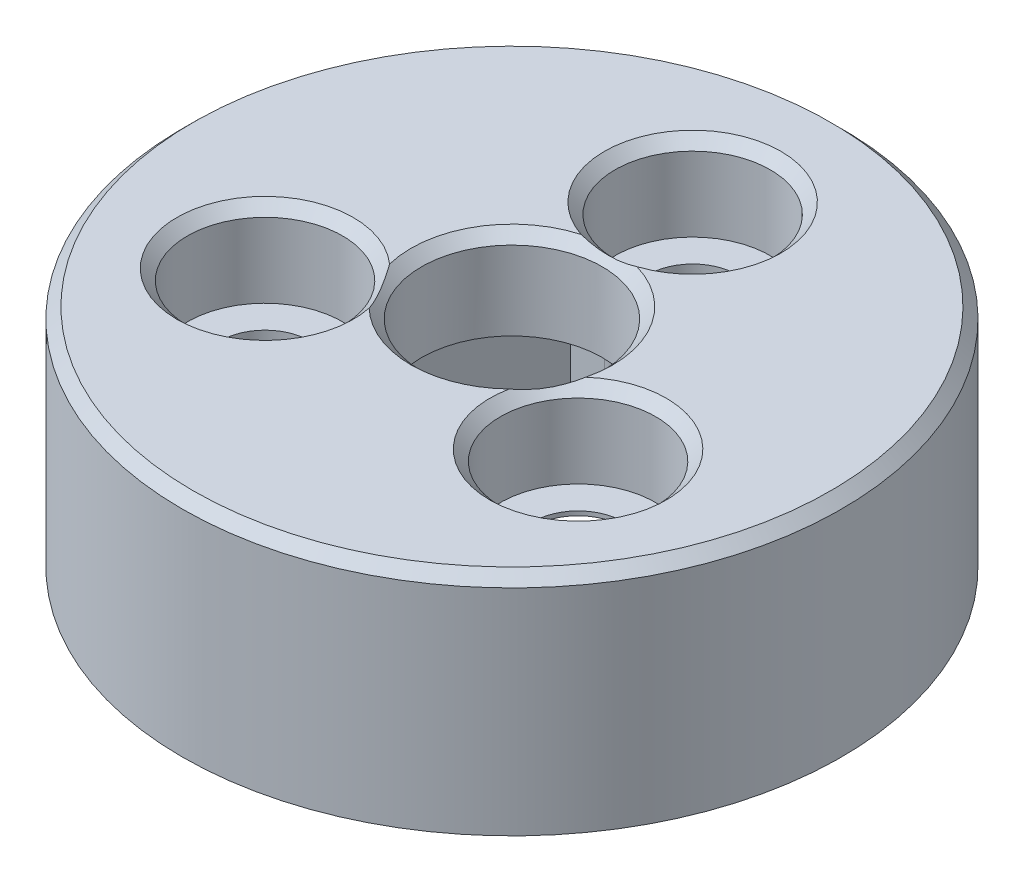
ISO-10303-21;
HEADER;
FILE_DESCRIPTION(('STEP AP214'),'2;1');
FILE_NAME('part.step','',(''),(''),'','','');
FILE_SCHEMA(('AUTOMOTIVE_DESIGN { 1 0 10303 214 1 1 1 1 }'));
ENDSEC;
DATA;
#1=APPLICATION_CONTEXT('core data for automotive mechanical design processes');
#2=APPLICATION_PROTOCOL_DEFINITION('international standard','automotive_design',2000,#1);
#3=PRODUCT_CONTEXT('',#1,'mechanical');
#4=PRODUCT('Part','Part','',(#3));
#5=PRODUCT_RELATED_PRODUCT_CATEGORY('part','',(#4));
#6=PRODUCT_DEFINITION_FORMATION('','',#4);
#7=PRODUCT_DEFINITION_CONTEXT('part definition',#1,'design');
#8=PRODUCT_DEFINITION('design','',#6,#7);
#9=PRODUCT_DEFINITION_SHAPE('','',#8);
#10=(LENGTH_UNIT() NAMED_UNIT(*) SI_UNIT(.MILLI.,.METRE.));
#11=(NAMED_UNIT(*) PLANE_ANGLE_UNIT() SI_UNIT($,.RADIAN.));
#12=(NAMED_UNIT(*) SI_UNIT($,.STERADIAN.) SOLID_ANGLE_UNIT());
#13=UNCERTAINTY_MEASURE_WITH_UNIT(LENGTH_MEASURE(1.E-05),#10,'distance_accuracy_value','');
#14=(GEOMETRIC_REPRESENTATION_CONTEXT(3) GLOBAL_UNCERTAINTY_ASSIGNED_CONTEXT((#13)) GLOBAL_UNIT_ASSIGNED_CONTEXT((#10,
#11,#12)) REPRESENTATION_CONTEXT('',''));
#15=CARTESIAN_POINT('',(0.,0.,0.));
#16=DIRECTION('',(0.,0.,1.));
#17=DIRECTION('',(1.,0.,0.));
#18=AXIS2_PLACEMENT_3D('',#15,#16,#17);
#19=CARTESIAN_POINT('',(-7.36121593216715,0.,4.25000000000033));
#20=DIRECTION('',(0.,1.,0.));
#21=DIRECTION('',(0.,0.,1.));
#22=AXIS2_PLACEMENT_3D('',#19,#20,#21);
#23=CYLINDRICAL_SURFACE('',#22,2.1);
#24=CARTESIAN_POINT('',(-7.36121593216715,6.4,4.25000000000033));
#25=DIRECTION('',(0.,-1.,0.));
#26=DIRECTION('',(0.,0.,-1.));
#27=AXIS2_PLACEMENT_3D('',#24,#25,#26);
#28=CIRCLE('',#27,2.1);
#29=CARTESIAN_POINT('',(-5.43622822501933,6.4,5.08929871162199));
#30=VERTEX_POINT('',#29);
#31=CARTESIAN_POINT('',(-7.11454987921227,6.4,2.16453701583599));
#32=VERTEX_POINT('',#31);
#33=EDGE_CURVE('E257',#30,#32,#28,.F.);
#34=ORIENTED_EDGE('',*,*,#33,.F.);
#35=DIRECTION('',(0.,1.,0.));
#36=VECTOR('',#35,1.);
#37=CARTESIAN_POINT('',(-5.43622822501933,0.,5.08929871162199));
#38=LINE('',#37,#36);
#39=CARTESIAN_POINT('',(-5.43622822501933,0.,5.08929871162199));
#40=VERTEX_POINT('',#39);
#41=EDGE_CURVE('E395',#30,#40,#38,.F.);
#42=ORIENTED_EDGE('',*,*,#41,.T.);
#43=CARTESIAN_POINT('',(-7.36121593216715,0.,4.25000000000033));
#44=DIRECTION('',(0.,1.,0.));
#45=DIRECTION('',(0.,0.,1.));
#46=AXIS2_PLACEMENT_3D('',#43,#44,#45);
#47=CIRCLE('',#46,2.1);
#48=CARTESIAN_POINT('',(-7.11454987921227,0.,2.16453701583599));
#49=VERTEX_POINT('',#48);
#50=EDGE_CURVE('E261',#49,#40,#47,.T.);
#51=ORIENTED_EDGE('',*,*,#50,.F.);
#52=DIRECTION('',(0.,1.,0.));
#53=VECTOR('',#52,1.);
#54=CARTESIAN_POINT('',(-7.11454987921227,0.,2.16453701583599));
#55=LINE('',#54,#53);
#56=EDGE_CURVE('E392',#49,#32,#55,.T.);
#57=ORIENTED_EDGE('',*,*,#56,.T.);
#58=EDGE_LOOP('',(#34,#42,#51,#57));
#59=FACE_BOUND('',#58,.T.);
#60=CARTESIAN_POINT('',(-7.36121593216715,6.6,4.25000000000033));
#61=DIRECTION('',(0.,1.,0.));
#62=DIRECTION('',(0.,0.,1.));
#63=AXIS2_PLACEMENT_3D('',#60,#61,#62);
#64=CIRCLE('',#63,2.1);
#65=CARTESIAN_POINT('',(-7.36121593216715,6.6,6.35000000000033));
#66=VERTEX_POINT('',#65);
#67=EDGE_CURVE('E283',#66,#66,#64,.F.);
#68=ORIENTED_EDGE('',*,*,#67,.F.);
#69=EDGE_LOOP('',(#68));
#70=FACE_BOUND('',#69,.T.);
#71=ADVANCED_FACE('F36',(#59,#70),#23,.F.);
#72=CARTESIAN_POINT('',(7.3612159321683,0.,4.24999999999967));
#73=DIRECTION('',(0.,1.,0.));
#74=DIRECTION('',(0.,0.,1.));
#75=AXIS2_PLACEMENT_3D('',#72,#73,#74);
#76=CYLINDRICAL_SURFACE('',#75,2.1);
#77=CARTESIAN_POINT('',(7.3612159321683,6.4,4.24999999999967));
#78=DIRECTION('',(0.,-1.,0.));
#79=DIRECTION('',(0.,0.,-1.));
#80=AXIS2_PLACEMENT_3D('',#77,#78,#79);
#81=CIRCLE('',#80,2.1);
#82=CARTESIAN_POINT('',(7.12557608422164,6.4,2.16326238782614));
#83=VERTEX_POINT('',#82);
#84=CARTESIAN_POINT('',(5.43181898275217,6.4,5.07911242397106));
#85=VERTEX_POINT('',#84);
#86=EDGE_CURVE('E255',#83,#85,#81,.F.);
#87=ORIENTED_EDGE('',*,*,#86,.F.);
#88=DIRECTION('',(0.,1.,0.));
#89=VECTOR('',#88,1.);
#90=CARTESIAN_POINT('',(7.12557608422164,0.,2.16326238782614));
#91=LINE('',#90,#89);
#92=CARTESIAN_POINT('',(7.12557608422164,0.,2.16326238782614));
#93=VERTEX_POINT('',#92);
#94=EDGE_CURVE('E373',#83,#93,#91,.F.);
#95=ORIENTED_EDGE('',*,*,#94,.T.);
#96=CARTESIAN_POINT('',(7.3612159321683,0.,4.24999999999967));
#97=DIRECTION('',(0.,1.,0.));
#98=DIRECTION('',(0.,0.,1.));
#99=AXIS2_PLACEMENT_3D('',#96,#97,#98);
#100=CIRCLE('',#99,2.1);
#101=CARTESIAN_POINT('',(5.43181898275217,0.,5.07911242397106));
#102=VERTEX_POINT('',#101);
#103=EDGE_CURVE('E262',#102,#93,#100,.T.);
#104=ORIENTED_EDGE('',*,*,#103,.F.);
#105=DIRECTION('',(0.,1.,0.));
#106=VECTOR('',#105,1.);
#107=CARTESIAN_POINT('',(5.43181898275217,0.,5.07911242397106));
#108=LINE('',#107,#106);
#109=EDGE_CURVE('E323',#102,#85,#108,.T.);
#110=ORIENTED_EDGE('',*,*,#109,.T.);
#111=EDGE_LOOP('',(#87,#95,#104,#110));
#112=FACE_BOUND('',#111,.T.);
#113=CARTESIAN_POINT('',(7.3612159321683,6.6,4.24999999999967));
#114=DIRECTION('',(0.,1.,0.));
#115=DIRECTION('',(0.,0.,1.));
#116=AXIS2_PLACEMENT_3D('',#113,#114,#115);
#117=CIRCLE('',#116,2.1);
#118=CARTESIAN_POINT('',(7.3612159321683,6.6,6.34999999999967));
#119=VERTEX_POINT('',#118);
#120=EDGE_CURVE('E280',#119,#119,#117,.F.);
#121=ORIENTED_EDGE('',*,*,#120,.F.);
#122=EDGE_LOOP('',(#121));
#123=FACE_BOUND('',#122,.T.);
#124=ADVANCED_FACE('F463',(#112,#123),#76,.F.);
#125=CARTESIAN_POINT('',(0.,0.,-8.5));
#126=DIRECTION('',(0.,1.,0.));
#127=DIRECTION('',(0.,0.,1.));
#128=AXIS2_PLACEMENT_3D('',#125,#126,#127);
#129=CYLINDRICAL_SURFACE('',#128,2.1);
#130=CARTESIAN_POINT('',(0.,0.,-8.5));
#131=DIRECTION('',(0.,1.,0.));
#132=DIRECTION('',(0.,0.,1.));
#133=AXIS2_PLACEMENT_3D('',#130,#131,#132);
#134=CIRCLE('',#133,2.1);
#135=CARTESIAN_POINT('',(1.68273089646079,0.,-7.24364943980739));
#136=VERTEX_POINT('',#135);
#137=CARTESIAN_POINT('',(-1.68934785920162,0.,-7.25256109944779));
#138=VERTEX_POINT('',#137);
#139=EDGE_CURVE('E265',#136,#138,#134,.T.);
#140=ORIENTED_EDGE('',*,*,#139,.F.);
#141=DIRECTION('',(0.,1.,0.));
#142=VECTOR('',#141,1.);
#143=CARTESIAN_POINT('',(1.68273089646079,0.,-7.24364943980739));
#144=LINE('',#143,#142);
#145=CARTESIAN_POINT('',(1.68273089646079,6.4,-7.24364943980739));
#146=VERTEX_POINT('',#145);
#147=EDGE_CURVE('E405',#136,#146,#144,.T.);
#148=ORIENTED_EDGE('',*,*,#147,.T.);
#149=CARTESIAN_POINT('',(0.,6.4,-8.5));
#150=DIRECTION('',(0.,-1.,0.));
#151=DIRECTION('',(0.,0.,-1.));
#152=AXIS2_PLACEMENT_3D('',#149,#150,#151);
#153=CIRCLE('',#152,2.1);
#154=CARTESIAN_POINT('',(-1.68934785920162,6.4,-7.25256109944779));
#155=VERTEX_POINT('',#154);
#156=EDGE_CURVE('E259',#155,#146,#153,.F.);
#157=ORIENTED_EDGE('',*,*,#156,.F.);
#158=DIRECTION('',(0.,1.,0.));
#159=VECTOR('',#158,1.);
#160=CARTESIAN_POINT('',(-1.68934785920162,0.,-7.25256109944779));
#161=LINE('',#160,#159);
#162=EDGE_CURVE('E402',#155,#138,#161,.F.);
#163=ORIENTED_EDGE('',*,*,#162,.T.);
#164=EDGE_LOOP('',(#140,#148,#157,#163));
#165=FACE_BOUND('',#164,.T.);
#166=CARTESIAN_POINT('',(0.,6.6,-8.5));
#167=DIRECTION('',(0.,1.,0.));
#168=DIRECTION('',(0.,0.,1.));
#169=AXIS2_PLACEMENT_3D('',#166,#167,#168);
#170=CIRCLE('',#169,2.1);
#171=CARTESIAN_POINT('',(0.,6.6,-6.4));
#172=VERTEX_POINT('',#171);
#173=EDGE_CURVE('E276',#172,#172,#170,.F.);
#174=ORIENTED_EDGE('',*,*,#173,.F.);
#175=EDGE_LOOP('',(#174));
#176=FACE_BOUND('',#175,.T.);
#177=ADVANCED_FACE('F491',(#165,#176),#129,.F.);
#178=CARTESIAN_POINT('',(0.,0.,0.));
#179=DIRECTION('',(0.,1.,0.));
#180=DIRECTION('',(0.,0.,1.));
#181=AXIS2_PLACEMENT_3D('',#178,#179,#180);
#182=CYLINDRICAL_SURFACE('',#181,4.25);
#183=CARTESIAN_POINT('',(0.,10.1,0.));
#184=DIRECTION('',(0.,1.,0.));
#185=DIRECTION('',(0.,0.,1.));
#186=AXIS2_PLACEMENT_3D('',#183,#184,#185);
#187=CIRCLE('',#186,4.25);
#188=CARTESIAN_POINT('',(0.,10.1,4.25));
#189=VERTEX_POINT('',#188);
#190=EDGE_CURVE('E314',#189,#189,#187,.T.);
#191=ORIENTED_EDGE('',*,*,#190,.T.);
#192=EDGE_LOOP('',(#191));
#193=FACE_BOUND('',#192,.T.);
#194=CARTESIAN_POINT('',(0.,6.4,0.));
#195=DIRECTION('',(0.,-1.,0.));
#196=DIRECTION('',(0.,0.,-1.));
#197=AXIS2_PLACEMENT_3D('',#194,#195,#196);
#198=CIRCLE('',#197,4.25);
#199=CARTESIAN_POINT('',(0.,6.4,-4.25));
#200=VERTEX_POINT('',#199);
#201=EDGE_CURVE('E245',#200,#200,#198,.F.);
#202=ORIENTED_EDGE('',*,*,#201,.F.);
#203=EDGE_LOOP('',(#202));
#204=FACE_BOUND('',#203,.T.);
#205=ADVANCED_FACE('F497',(#193,#204),#182,.F.);
#206=CARTESIAN_POINT('',(0.,10.6,0.));
#207=DIRECTION('',(0.,-1.,0.));
#208=DIRECTION('',(0.,0.,-1.));
#209=AXIS2_PLACEMENT_3D('',#206,#207,#208);
#210=CYLINDRICAL_SURFACE('',#209,15.5);
#211=CARTESIAN_POINT('',(0.,10.1,0.));
#212=DIRECTION('',(0.,1.,0.));
#213=DIRECTION('',(0.,0.,1.));
#214=AXIS2_PLACEMENT_3D('',#211,#212,#213);
#215=CIRCLE('',#214,15.5);
#216=CARTESIAN_POINT('',(0.,10.1,15.5));
#217=VERTEX_POINT('',#216);
#218=EDGE_CURVE('E320',#217,#217,#215,.F.);
#219=ORIENTED_EDGE('',*,*,#218,.T.);
#220=EDGE_LOOP('',(#219));
#221=FACE_BOUND('',#220,.T.);
#222=CARTESIAN_POINT('',(0.,0.,0.));
#223=DIRECTION('',(0.,1.,0.));
#224=DIRECTION('',(0.,0.,1.));
#225=AXIS2_PLACEMENT_3D('',#222,#223,#224);
#226=CIRCLE('',#225,15.5);
#227=CARTESIAN_POINT('',(0.,0.,15.5));
#228=VERTEX_POINT('',#227);
#229=EDGE_CURVE('E270',#228,#228,#226,.T.);
#230=ORIENTED_EDGE('',*,*,#229,.T.);
#231=EDGE_LOOP('',(#230));
#232=FACE_BOUND('',#231,.T.);
#233=ADVANCED_FACE('F502',(#221,#232),#210,.T.);
#234=CARTESIAN_POINT('',(0.,10.6,0.));
#235=DIRECTION('',(0.,1.,0.));
#236=DIRECTION('',(0.,0.,1.));
#237=AXIS2_PLACEMENT_3D('',#234,#235,#236);
#238=PLANE('',#237);
#239=CARTESIAN_POINT('',(7.3612159321683,10.6,4.24999999999967));
#240=DIRECTION('',(0.,1.,0.));
#241=DIRECTION('',(0.,0.,1.));
#242=AXIS2_PLACEMENT_3D('',#239,#240,#241);
#243=CIRCLE('',#242,4.15);
#244=CARTESIAN_POINT('',(4.61054191633621,10.6,1.14254244459748));
#245=VERTEX_POINT('',#244);
#246=CARTESIAN_POINT('',(7.3612159321683,10.6,8.39999999999967));
#247=VERTEX_POINT('',#246);
#248=EDGE_CURVE('E298',#245,#247,#243,.F.);
#249=ORIENTED_EDGE('',*,*,#248,.T.);
#250=CARTESIAN_POINT('',(7.3612159321683,10.6,4.24999999999967));
#251=DIRECTION('',(0.,1.,0.));
#252=DIRECTION('',(0.,0.,1.));
#253=AXIS2_PLACEMENT_3D('',#250,#251,#252);
#254=CIRCLE('',#253,4.15);
#255=CARTESIAN_POINT('',(3.29474174009196,10.6,3.42157520246096));
#256=VERTEX_POINT('',#255);
#257=EDGE_CURVE('E309',#247,#256,#254,.F.);
#258=ORIENTED_EDGE('',*,*,#257,.T.);
#259=CARTESIAN_POINT('',(0.,10.6,0.));
#260=DIRECTION('',(0.,1.,0.));
#261=DIRECTION('',(0.,0.,1.));
#262=AXIS2_PLACEMENT_3D('',#259,#260,#261);
#263=CIRCLE('',#262,4.75);
#264=CARTESIAN_POINT('',(0.,10.6,4.75));
#265=VERTEX_POINT('',#264);
#266=EDGE_CURVE('E307',#256,#265,#263,.F.);
#267=ORIENTED_EDGE('',*,*,#266,.T.);
#268=CARTESIAN_POINT('',(0.,10.6,0.));
#269=DIRECTION('',(0.,1.,0.));
#270=DIRECTION('',(0.,0.,1.));
#271=AXIS2_PLACEMENT_3D('',#268,#269,#270);
#272=CIRCLE('',#271,4.75);
#273=CARTESIAN_POINT('',(-3.2947417400907,10.6,3.42157520246218));
#274=VERTEX_POINT('',#273);
#275=EDGE_CURVE('E305',#265,#274,#272,.F.);
#276=ORIENTED_EDGE('',*,*,#275,.T.);
#277=CARTESIAN_POINT('',(-7.36121593216715,10.6,4.25000000000033));
#278=DIRECTION('',(0.,1.,0.));
#279=DIRECTION('',(0.,0.,1.));
#280=AXIS2_PLACEMENT_3D('',#277,#278,#279);
#281=CIRCLE('',#280,4.15);
#282=CARTESIAN_POINT('',(-7.36121593216715,10.6,8.40000000000034));
#283=VERTEX_POINT('',#282);
#284=EDGE_CURVE('E302',#274,#283,#281,.F.);
#285=ORIENTED_EDGE('',*,*,#284,.T.);
#286=CARTESIAN_POINT('',(-7.36121593216715,10.6,4.25000000000033));
#287=DIRECTION('',(0.,1.,0.));
#288=DIRECTION('',(0.,0.,1.));
#289=AXIS2_PLACEMENT_3D('',#286,#287,#288);
#290=CIRCLE('',#289,4.15);
#291=CARTESIAN_POINT('',(-4.61054191633632,10.6,1.14254244459703));
#292=VERTEX_POINT('',#291);
#293=EDGE_CURVE('E300',#283,#292,#290,.F.);
#294=ORIENTED_EDGE('',*,*,#293,.T.);
#295=CARTESIAN_POINT('',(0.,10.6,0.));
#296=DIRECTION('',(0.,1.,0.));
#297=DIRECTION('',(0.,0.,1.));
#298=AXIS2_PLACEMENT_3D('',#295,#296,#297);
#299=CIRCLE('',#298,4.75);
#300=CARTESIAN_POINT('',(-1.31580017624494,10.6,-4.56411764705882));
#301=VERTEX_POINT('',#300);
#302=EDGE_CURVE('E294',#292,#301,#299,.F.);
#303=ORIENTED_EDGE('',*,*,#302,.T.);
#304=CARTESIAN_POINT('',(0.,10.6,-8.5));
#305=DIRECTION('',(0.,1.,0.));
#306=DIRECTION('',(0.,0.,1.));
#307=AXIS2_PLACEMENT_3D('',#304,#305,#306);
#308=CIRCLE('',#307,4.15);
#309=CARTESIAN_POINT('',(1.31580017624494,10.6,-4.56411764705882));
#310=VERTEX_POINT('',#309);
#311=EDGE_CURVE('E292',#301,#310,#308,.F.);
#312=ORIENTED_EDGE('',*,*,#311,.T.);
#313=CARTESIAN_POINT('',(0.,10.6,0.));
#314=DIRECTION('',(0.,1.,0.));
#315=DIRECTION('',(0.,0.,1.));
#316=AXIS2_PLACEMENT_3D('',#313,#314,#315);
#317=CIRCLE('',#316,4.75);
#318=EDGE_CURVE('E296',#310,#245,#317,.F.);
#319=ORIENTED_EDGE('',*,*,#318,.T.);
#320=EDGE_LOOP('',(#249,#258,#267,#276,#285,#294,#303,#312,#319));
#321=FACE_BOUND('',#320,.T.);
#322=CARTESIAN_POINT('',(0.,10.6,0.));
#323=DIRECTION('',(0.,1.,0.));
#324=DIRECTION('',(0.,0.,1.));
#325=AXIS2_PLACEMENT_3D('',#322,#323,#324);
#326=CIRCLE('',#325,15.);
#327=CARTESIAN_POINT('',(0.,10.6,15.));
#328=VERTEX_POINT('',#327);
#329=EDGE_CURVE('E289',#328,#328,#326,.T.);
#330=ORIENTED_EDGE('',*,*,#329,.T.);
#331=EDGE_LOOP('',(#330));
#332=FACE_BOUND('',#331,.T.);
#333=ADVANCED_FACE('F499',(#321,#332),#238,.T.);
#334=CARTESIAN_POINT('',(0.,0.,0.));
#335=DIRECTION('',(0.,1.,0.));
#336=DIRECTION('',(0.,0.,1.));
#337=AXIS2_PLACEMENT_3D('',#334,#335,#336);
#338=PLANE('',#337);
#339=ORIENTED_EDGE('',*,*,#103,.T.);
#340=CARTESIAN_POINT('',(7.06947135852005,0.,1.6664200992134));
#341=DIRECTION('',(0.,1.,0.));
#342=DIRECTION('',(0.,0.,1.));
#343=AXIS2_PLACEMENT_3D('',#340,#341,#342);
#344=CIRCLE('',#343,0.5);
#345=CARTESIAN_POINT('',(6.63712086125736,0.,1.41527661927274));
#346=VERTEX_POINT('',#345);
#347=EDGE_CURVE('E386',#93,#346,#344,.F.);
#348=ORIENTED_EDGE('',*,*,#347,.T.);
#349=DIRECTION('',(-0.502286959881321,0.,0.864700994525379));
#350=VECTOR('',#349,1.);
#351=CARTESIAN_POINT('',(7.44779246385028,0.,0.019682871106941));
#352=LINE('',#351,#350);
#353=CARTESIAN_POINT('',(7.44779246385028,0.,0.019682871106941));
#354=VERTEX_POINT('',#353);
#355=EDGE_CURVE('E231',#354,#346,#352,.T.);
#356=ORIENTED_EDGE('',*,*,#355,.F.);
#357=DIRECTION('',(0.497709547995986,0.,0.867343764509569));
#358=VECTOR('',#357,1.);
#359=CARTESIAN_POINT('',(3.74094209832316,0.,-6.44013604025517));
#360=LINE('',#359,#358);
#361=CARTESIAN_POINT('',(3.74094209832316,0.,-6.44013604025517));
#362=VERTEX_POINT('',#361);
#363=EDGE_CURVE('E228',#362,#354,#360,.T.);
#364=ORIENTED_EDGE('',*,*,#363,.F.);
#365=DIRECTION('',(0.999996507877308,0.,0.00264276998419002));
#366=VECTOR('',#365,1.);
#367=CARTESIAN_POINT('',(-3.70685036552711,0.,-6.45981891136211));
#368=LINE('',#367,#366);
#369=CARTESIAN_POINT('',(2.08205972491174,0.,-6.4445201001086));
#370=VERTEX_POINT('',#369);
#371=EDGE_CURVE('E202',#370,#362,#368,.T.);
#372=ORIENTED_EDGE('',*,*,#371,.F.);
#373=CARTESIAN_POINT('',(2.08338110990383,0.,-6.94451835404725));
#374=DIRECTION('',(0.,1.,0.));
#375=DIRECTION('',(0.,0.,1.));
#376=AXIS2_PLACEMENT_3D('',#373,#374,#375);
#377=CIRCLE('',#376,0.5);
#378=EDGE_CURVE('E378',#370,#136,#377,.F.);
#379=ORIENTED_EDGE('',*,*,#378,.T.);
#380=ORIENTED_EDGE('',*,*,#139,.T.);
#381=CARTESIAN_POINT('',(-2.09157353996391,0.,-6.95555183741155));
#382=DIRECTION('',(0.,1.,0.));
#383=DIRECTION('',(0.,0.,1.));
#384=AXIS2_PLACEMENT_3D('',#381,#382,#383);
#385=CIRCLE('',#384,0.5);
#386=CARTESIAN_POINT('',(-2.09289492495601,0.,-6.4555535834729));
#387=VERTEX_POINT('',#386);
#388=EDGE_CURVE('E376',#138,#387,#385,.F.);
#389=ORIENTED_EDGE('',*,*,#388,.T.);
#390=CARTESIAN_POINT('',(-3.70685036552711,0.,-6.45981891136211));
#391=VERTEX_POINT('',#390);
#392=EDGE_CURVE('E226',#391,#387,#368,.T.);
#393=ORIENTED_EDGE('',*,*,#392,.F.);
#394=DIRECTION('',(0.502286959881321,0.,-0.864700994525379));
#395=VECTOR('',#394,1.);
#396=CARTESIAN_POINT('',(-7.44779246385028,0.,-0.019682871106941));
#397=LINE('',#396,#395);
#398=CARTESIAN_POINT('',(-7.44779246385028,0.,-0.019682871106941));
#399=VERTEX_POINT('',#398);
#400=EDGE_CURVE('E196',#399,#391,#397,.T.);
#401=ORIENTED_EDGE('',*,*,#400,.F.);
#402=DIRECTION('',(-0.497709547995986,0.,-0.867343764509569));
#403=VECTOR('',#402,1.);
#404=CARTESIAN_POINT('',(-3.74094209832316,0.,6.44013604025517));
#405=LINE('',#404,#403);
#406=CARTESIAN_POINT('',(-6.62214798434918,0.,1.41914343608458));
#407=VERTEX_POINT('',#406);
#408=EDGE_CURVE('E237',#407,#399,#405,.T.);
#409=ORIENTED_EDGE('',*,*,#408,.F.);
#410=CARTESIAN_POINT('',(-7.05581986660396,0.,1.66799821008257));
#411=DIRECTION('',(0.,1.,0.));
#412=DIRECTION('',(0.,0.,1.));
#413=AXIS2_PLACEMENT_3D('',#410,#411,#412);
#414=CIRCLE('',#413,0.5);
#415=EDGE_CURVE('E380',#407,#49,#414,.F.);
#416=ORIENTED_EDGE('',*,*,#415,.T.);
#417=ORIENTED_EDGE('',*,*,#50,.T.);
#418=CARTESIAN_POINT('',(-4.97789781855557,0.,5.28913173819858));
#419=DIRECTION('',(0.,1.,0.));
#420=DIRECTION('',(0.,0.,1.));
#421=AXIS2_PLACEMENT_3D('',#418,#419,#420);
#422=CIRCLE('',#421,0.5);
#423=CARTESIAN_POINT('',(-4.54422593630078,0.,5.04027696420059));
#424=VERTEX_POINT('',#423);
#425=EDGE_CURVE('E382',#40,#424,#422,.F.);
#426=ORIENTED_EDGE('',*,*,#425,.T.);
#427=CARTESIAN_POINT('',(-3.74094209832316,0.,6.44013604025517));
#428=VERTEX_POINT('',#427);
#429=EDGE_CURVE('E238',#428,#424,#405,.T.);
#430=ORIENTED_EDGE('',*,*,#429,.F.);
#431=DIRECTION('',(-0.999996507877308,0.,-0.0026427699841899));
#432=VECTOR('',#431,1.);
#433=CARTESIAN_POINT('',(3.70685036552711,0.,6.45981891136211));
#434=LINE('',#433,#432);
#435=CARTESIAN_POINT('',(3.70685036552711,0.,6.45981891136211));
#436=VERTEX_POINT('',#435);
#437=EDGE_CURVE('E234',#436,#428,#434,.T.);
#438=ORIENTED_EDGE('',*,*,#437,.F.);
#439=CARTESIAN_POINT('',(4.54008825943802,0.,5.02537666402359));
#440=VERTEX_POINT('',#439);
#441=EDGE_CURVE('E230',#440,#436,#352,.T.);
#442=ORIENTED_EDGE('',*,*,#441,.F.);
#443=CARTESIAN_POINT('',(4.97243875670071,0.,5.27652014396425));
#444=DIRECTION('',(0.,1.,0.));
#445=DIRECTION('',(0.,0.,1.));
#446=AXIS2_PLACEMENT_3D('',#443,#444,#445);
#447=CIRCLE('',#446,0.5);
#448=EDGE_CURVE('E384',#440,#102,#447,.F.);
#449=ORIENTED_EDGE('',*,*,#448,.T.);
#450=EDGE_LOOP('',(#339,#348,#356,#364,#372,#379,#380,#389,#393,#401,#409,#416,#417,#426,#430,
#438,#442,#449));
#451=FACE_BOUND('',#450,.T.);
#452=ORIENTED_EDGE('',*,*,#229,.F.);
#453=EDGE_LOOP('',(#452));
#454=FACE_BOUND('',#453,.T.);
#455=ADVANCED_FACE('F434',(#451,#454),#338,.F.);
#456=CARTESIAN_POINT('',(-3.70685036552711,6.4,-6.45981891136211));
#457=DIRECTION('',(0.00264276998419002,0.,-0.999996507877308));
#458=DIRECTION('',(-0.999996507877308,0.,-0.00264276998419002));
#459=AXIS2_PLACEMENT_3D('',#456,#457,#458);
#460=PLANE('',#459);
#461=ORIENTED_EDGE('',*,*,#392,.T.);
#462=DIRECTION('',(0.,1.,0.));
#463=VECTOR('',#462,1.);
#464=CARTESIAN_POINT('',(-2.09289492495601,6.4,-6.4555535834729));
#465=LINE('',#464,#463);
#466=CARTESIAN_POINT('',(-2.09289492495601,6.4,-6.4555535834729));
#467=VERTEX_POINT('',#466);
#468=EDGE_CURVE('E51',#387,#467,#465,.T.);
#469=ORIENTED_EDGE('',*,*,#468,.T.);
#470=DIRECTION('',(0.999996507877308,0.,0.00264276998419002));
#471=VECTOR('',#470,1.);
#472=CARTESIAN_POINT('',(-3.70685036552711,6.4,-6.45981891136211));
#473=LINE('',#472,#471);
#474=CARTESIAN_POINT('',(-3.70685036552711,6.4,-6.45981891136211));
#475=VERTEX_POINT('',#474);
#476=EDGE_CURVE('E195',#475,#467,#473,.T.);
#477=ORIENTED_EDGE('',*,*,#476,.F.);
#478=DIRECTION('',(0.,-1.,0.));
#479=VECTOR('',#478,1.);
#480=CARTESIAN_POINT('',(-3.70685036552711,6.4,-6.45981891136211));
#481=LINE('',#480,#479);
#482=EDGE_CURVE('E243',#475,#391,#481,.T.);
#483=ORIENTED_EDGE('',*,*,#482,.T.);
#484=EDGE_LOOP('',(#461,#469,#477,#483));
#485=FACE_BOUND('',#484,.T.);
#486=ADVANCED_FACE('F505',(#485),#460,.F.);
#487=CARTESIAN_POINT('',(2.08205972491174,6.4,-6.4445201001086));
#488=VERTEX_POINT('',#487);
#489=CARTESIAN_POINT('',(3.74094209832316,6.4,-6.44013604025517));
#490=VERTEX_POINT('',#489);
#491=EDGE_CURVE('E187',#488,#490,#473,.T.);
#492=ORIENTED_EDGE('',*,*,#491,.F.);
#493=DIRECTION('',(0.,1.,0.));
#494=VECTOR('',#493,1.);
#495=CARTESIAN_POINT('',(2.08205972491174,6.4,-6.4445201001086));
#496=LINE('',#495,#494);
#497=EDGE_CURVE('E408',#488,#370,#496,.F.);
#498=ORIENTED_EDGE('',*,*,#497,.T.);
#499=ORIENTED_EDGE('',*,*,#371,.T.);
#500=DIRECTION('',(0.,-1.,0.));
#501=VECTOR('',#500,1.);
#502=CARTESIAN_POINT('',(3.74094209832316,6.4,-6.44013604025517));
#503=LINE('',#502,#501);
#504=EDGE_CURVE('E199',#490,#362,#503,.T.);
#505=ORIENTED_EDGE('',*,*,#504,.F.);
#506=EDGE_LOOP('',(#492,#498,#499,#505));
#507=FACE_BOUND('',#506,.T.);
#508=ADVANCED_FACE('F200',(#507),#460,.F.);
#509=CARTESIAN_POINT('',(-3.74094209832316,6.4,6.44013604025517));
#510=DIRECTION('',(-0.867343764509569,0.,0.497709547995986));
#511=DIRECTION('',(0.497709547995986,0.,0.867343764509569));
#512=AXIS2_PLACEMENT_3D('',#509,#510,#511);
#513=PLANE('',#512);
#514=ORIENTED_EDGE('',*,*,#429,.T.);
#515=DIRECTION('',(0.,1.,0.));
#516=VECTOR('',#515,1.);
#517=CARTESIAN_POINT('',(-4.54422593630078,6.4,5.04027696420059));
#518=LINE('',#517,#516);
#519=CARTESIAN_POINT('',(-4.54422593630078,6.4,5.04027696420059));
#520=VERTEX_POINT('',#519);
#521=EDGE_CURVE('E398',#424,#520,#518,.T.);
#522=ORIENTED_EDGE('',*,*,#521,.T.);
#523=DIRECTION('',(-0.497709547995986,0.,-0.867343764509569));
#524=VECTOR('',#523,1.);
#525=CARTESIAN_POINT('',(-3.74094209832316,6.4,6.44013604025517));
#526=LINE('',#525,#524);
#527=CARTESIAN_POINT('',(-3.74094209832316,6.4,6.44013604025517));
#528=VERTEX_POINT('',#527);
#529=EDGE_CURVE('E221',#528,#520,#526,.T.);
#530=ORIENTED_EDGE('',*,*,#529,.F.);
#531=DIRECTION('',(0.,-1.,0.));
#532=VECTOR('',#531,1.);
#533=CARTESIAN_POINT('',(-3.74094209832316,6.4,6.44013604025517));
#534=LINE('',#533,#532);
#535=EDGE_CURVE('E249',#528,#428,#534,.T.);
#536=ORIENTED_EDGE('',*,*,#535,.T.);
#537=EDGE_LOOP('',(#514,#522,#530,#536));
#538=FACE_BOUND('',#537,.T.);
#539=ADVANCED_FACE('F447',(#538),#513,.F.);
#540=CARTESIAN_POINT('',(-6.62214798434918,6.4,1.41914343608458));
#541=VERTEX_POINT('',#540);
#542=CARTESIAN_POINT('',(-7.44779246385028,6.4,-0.019682871106941));
#543=VERTEX_POINT('',#542);
#544=EDGE_CURVE('E220',#541,#543,#526,.T.);
#545=ORIENTED_EDGE('',*,*,#544,.F.);
#546=DIRECTION('',(0.,1.,0.));
#547=VECTOR('',#546,1.);
#548=CARTESIAN_POINT('',(-6.62214798434918,6.4,1.41914343608458));
#549=LINE('',#548,#547);
#550=EDGE_CURVE('E400',#541,#407,#549,.F.);
#551=ORIENTED_EDGE('',*,*,#550,.T.);
#552=ORIENTED_EDGE('',*,*,#408,.T.);
#553=DIRECTION('',(0.,-1.,0.));
#554=VECTOR('',#553,1.);
#555=CARTESIAN_POINT('',(-7.44779246385028,6.4,-0.019682871106941));
#556=LINE('',#555,#554);
#557=EDGE_CURVE('E246',#543,#399,#556,.T.);
#558=ORIENTED_EDGE('',*,*,#557,.F.);
#559=EDGE_LOOP('',(#545,#551,#552,#558));
#560=FACE_BOUND('',#559,.T.);
#561=ADVANCED_FACE('F427',(#560),#513,.F.);
#562=CARTESIAN_POINT('',(7.44779246385028,6.4,0.019682871106941));
#563=DIRECTION('',(0.864700994525379,0.,0.502286959881321));
#564=DIRECTION('',(0.502286959881321,0.,-0.864700994525379));
#565=AXIS2_PLACEMENT_3D('',#562,#563,#564);
#566=PLANE('',#565);
#567=ORIENTED_EDGE('',*,*,#355,.T.);
#568=DIRECTION('',(0.,1.,0.));
#569=VECTOR('',#568,1.);
#570=CARTESIAN_POINT('',(6.63712086125736,6.4,1.41527661927274));
#571=LINE('',#570,#569);
#572=CARTESIAN_POINT('',(6.63712086125736,6.4,1.41527661927274));
#573=VERTEX_POINT('',#572);
#574=EDGE_CURVE('E388',#346,#573,#571,.T.);
#575=ORIENTED_EDGE('',*,*,#574,.T.);
#576=DIRECTION('',(-0.502286959881321,0.,0.864700994525379));
#577=VECTOR('',#576,1.);
#578=CARTESIAN_POINT('',(7.44779246385028,6.4,0.019682871106941));
#579=LINE('',#578,#577);
#580=CARTESIAN_POINT('',(7.44779246385028,6.4,0.019682871106941));
#581=VERTEX_POINT('',#580);
#582=EDGE_CURVE('E213',#581,#573,#579,.T.);
#583=ORIENTED_EDGE('',*,*,#582,.F.);
#584=DIRECTION('',(0.,-1.,0.));
#585=VECTOR('',#584,1.);
#586=CARTESIAN_POINT('',(7.44779246385028,6.4,0.019682871106941));
#587=LINE('',#586,#585);
#588=EDGE_CURVE('E206',#581,#354,#587,.T.);
#589=ORIENTED_EDGE('',*,*,#588,.T.);
#590=EDGE_LOOP('',(#567,#575,#583,#589));
#591=FACE_BOUND('',#590,.T.);
#592=ADVANCED_FACE('F470',(#591),#566,.F.);
#593=CARTESIAN_POINT('',(4.54008825943802,6.4,5.02537666402359));
#594=VERTEX_POINT('',#593);
#595=CARTESIAN_POINT('',(3.70685036552711,6.4,6.45981891136211));
#596=VERTEX_POINT('',#595);
#597=EDGE_CURVE('E211',#594,#596,#579,.T.);
#598=ORIENTED_EDGE('',*,*,#597,.F.);
#599=DIRECTION('',(0.,1.,0.));
#600=VECTOR('',#599,1.);
#601=CARTESIAN_POINT('',(4.54008825943802,6.4,5.02537666402359));
#602=LINE('',#601,#600);
#603=EDGE_CURVE('E390',#594,#440,#602,.F.);
#604=ORIENTED_EDGE('',*,*,#603,.T.);
#605=ORIENTED_EDGE('',*,*,#441,.T.);
#606=DIRECTION('',(0.,-1.,0.));
#607=VECTOR('',#606,1.);
#608=CARTESIAN_POINT('',(3.70685036552711,6.4,6.45981891136211));
#609=LINE('',#608,#607);
#610=EDGE_CURVE('E251',#596,#436,#609,.T.);
#611=ORIENTED_EDGE('',*,*,#610,.F.);
#612=EDGE_LOOP('',(#598,#604,#605,#611));
#613=FACE_BOUND('',#612,.T.);
#614=ADVANCED_FACE('F474',(#613),#566,.F.);
#615=CARTESIAN_POINT('',(0.,6.4,0.));
#616=DIRECTION('',(0.,-1.,0.));
#617=DIRECTION('',(0.,0.,-1.));
#618=AXIS2_PLACEMENT_3D('',#615,#616,#617);
#619=PLANE('',#618);
#620=ORIENTED_EDGE('',*,*,#201,.T.);
#621=EDGE_LOOP('',(#620));
#622=FACE_BOUND('',#621,.T.);
#623=ORIENTED_EDGE('',*,*,#156,.T.);
#624=CARTESIAN_POINT('',(2.08338110990383,6.4,-6.94451835404725));
#625=DIRECTION('',(0.,-1.,0.));
#626=DIRECTION('',(0.,0.,-1.));
#627=AXIS2_PLACEMENT_3D('',#624,#625,#626);
#628=CIRCLE('',#627,0.5);
#629=EDGE_CURVE('E44',#146,#488,#628,.F.);
#630=ORIENTED_EDGE('',*,*,#629,.T.);
#631=ORIENTED_EDGE('',*,*,#491,.T.);
#632=DIRECTION('',(0.497709547995986,0.,0.867343764509569));
#633=VECTOR('',#632,1.);
#634=CARTESIAN_POINT('',(3.74094209832316,6.4,-6.44013604025517));
#635=LINE('',#634,#633);
#636=EDGE_CURVE('E192',#490,#581,#635,.T.);
#637=ORIENTED_EDGE('',*,*,#636,.T.);
#638=ORIENTED_EDGE('',*,*,#582,.T.);
#639=CARTESIAN_POINT('',(7.06947135852005,6.4,1.6664200992134));
#640=DIRECTION('',(0.,-1.,0.));
#641=DIRECTION('',(0.,0.,-1.));
#642=AXIS2_PLACEMENT_3D('',#639,#640,#641);
#643=CIRCLE('',#642,0.5);
#644=EDGE_CURVE('E411',#573,#83,#643,.F.);
#645=ORIENTED_EDGE('',*,*,#644,.T.);
#646=ORIENTED_EDGE('',*,*,#86,.T.);
#647=CARTESIAN_POINT('',(4.97243875670071,6.4,5.27652014396425));
#648=DIRECTION('',(0.,-1.,0.));
#649=DIRECTION('',(0.,0.,-1.));
#650=AXIS2_PLACEMENT_3D('',#647,#648,#649);
#651=CIRCLE('',#650,0.5);
#652=EDGE_CURVE('E414',#85,#594,#651,.F.);
#653=ORIENTED_EDGE('',*,*,#652,.T.);
#654=ORIENTED_EDGE('',*,*,#597,.T.);
#655=DIRECTION('',(-0.999996507877308,0.,-0.0026427699841899));
#656=VECTOR('',#655,1.);
#657=CARTESIAN_POINT('',(3.70685036552711,6.4,6.45981891136211));
#658=LINE('',#657,#656);
#659=EDGE_CURVE('E217',#596,#528,#658,.T.);
#660=ORIENTED_EDGE('',*,*,#659,.T.);
#661=ORIENTED_EDGE('',*,*,#529,.T.);
#662=CARTESIAN_POINT('',(-4.97789781855557,6.4,5.28913173819858));
#663=DIRECTION('',(0.,-1.,0.));
#664=DIRECTION('',(0.,0.,-1.));
#665=AXIS2_PLACEMENT_3D('',#662,#663,#664);
#666=CIRCLE('',#665,0.5);
#667=EDGE_CURVE('E416',#520,#30,#666,.F.);
#668=ORIENTED_EDGE('',*,*,#667,.T.);
#669=ORIENTED_EDGE('',*,*,#33,.T.);
#670=CARTESIAN_POINT('',(-7.05581986660396,6.4,1.66799821008257));
#671=DIRECTION('',(0.,-1.,0.));
#672=DIRECTION('',(0.,0.,-1.));
#673=AXIS2_PLACEMENT_3D('',#670,#671,#672);
#674=CIRCLE('',#673,0.5);
#675=EDGE_CURVE('E419',#32,#541,#674,.F.);
#676=ORIENTED_EDGE('',*,*,#675,.T.);
#677=ORIENTED_EDGE('',*,*,#544,.T.);
#678=DIRECTION('',(0.502286959881321,0.,-0.864700994525379));
#679=VECTOR('',#678,1.);
#680=CARTESIAN_POINT('',(-7.44779246385028,6.4,-0.019682871106941));
#681=LINE('',#680,#679);
#682=EDGE_CURVE('E207',#543,#475,#681,.T.);
#683=ORIENTED_EDGE('',*,*,#682,.T.);
#684=ORIENTED_EDGE('',*,*,#476,.T.);
#685=CARTESIAN_POINT('',(-2.09157353996391,6.4,-6.95555183741155));
#686=DIRECTION('',(0.,-1.,0.));
#687=DIRECTION('',(0.,0.,-1.));
#688=AXIS2_PLACEMENT_3D('',#685,#686,#687);
#689=CIRCLE('',#688,0.5);
#690=EDGE_CURVE('E11',#467,#155,#689,.F.);
#691=ORIENTED_EDGE('',*,*,#690,.T.);
#692=EDGE_LOOP('',(#623,#630,#631,#637,#638,#645,#646,#653,#654,#660,#661,#668,#669,#676,#677,
#683,#684,#691));
#693=FACE_BOUND('',#692,.T.);
#694=ADVANCED_FACE('F189',(#622,#693),#619,.T.);
#695=CARTESIAN_POINT('',(-7.44779246385028,6.4,-0.019682871106941));
#696=DIRECTION('',(-0.864700994525379,0.,-0.502286959881321));
#697=DIRECTION('',(-0.502286959881321,0.,0.864700994525379));
#698=AXIS2_PLACEMENT_3D('',#695,#696,#697);
#699=PLANE('',#698);
#700=ORIENTED_EDGE('',*,*,#400,.T.);
#701=ORIENTED_EDGE('',*,*,#482,.F.);
#702=ORIENTED_EDGE('',*,*,#682,.F.);
#703=ORIENTED_EDGE('',*,*,#557,.T.);
#704=EDGE_LOOP('',(#700,#701,#702,#703));
#705=FACE_BOUND('',#704,.T.);
#706=ADVANCED_FACE('F481',(#705),#699,.F.);
#707=CARTESIAN_POINT('',(3.70685036552711,6.4,6.45981891136211));
#708=DIRECTION('',(-0.0026427699841899,0.,0.999996507877308));
#709=DIRECTION('',(0.999996507877308,0.,0.0026427699841899));
#710=AXIS2_PLACEMENT_3D('',#707,#708,#709);
#711=PLANE('',#710);
#712=ORIENTED_EDGE('',*,*,#437,.T.);
#713=ORIENTED_EDGE('',*,*,#535,.F.);
#714=ORIENTED_EDGE('',*,*,#659,.F.);
#715=ORIENTED_EDGE('',*,*,#610,.T.);
#716=EDGE_LOOP('',(#712,#713,#714,#715));
#717=FACE_BOUND('',#716,.T.);
#718=ADVANCED_FACE('F451',(#717),#711,.F.);
#719=CARTESIAN_POINT('',(3.74094209832316,6.4,-6.44013604025517));
#720=DIRECTION('',(0.867343764509569,0.,-0.497709547995986));
#721=DIRECTION('',(-0.497709547995986,0.,-0.867343764509569));
#722=AXIS2_PLACEMENT_3D('',#719,#720,#721);
#723=PLANE('',#722);
#724=ORIENTED_EDGE('',*,*,#363,.T.);
#725=ORIENTED_EDGE('',*,*,#588,.F.);
#726=ORIENTED_EDGE('',*,*,#636,.F.);
#727=ORIENTED_EDGE('',*,*,#504,.T.);
#728=EDGE_LOOP('',(#724,#725,#726,#727));
#729=FACE_BOUND('',#728,.T.);
#730=ADVANCED_FACE('F209',(#729),#723,.F.);
#731=CARTESIAN_POINT('',(0.,6.6,-8.5));
#732=DIRECTION('',(0.,1.,0.));
#733=DIRECTION('',(0.,0.,1.));
#734=AXIS2_PLACEMENT_3D('',#731,#732,#733);
#735=PLANE('',#734);
#736=CARTESIAN_POINT('',(0.,6.6,-8.5));
#737=DIRECTION('',(0.,1.,0.));
#738=DIRECTION('',(0.,0.,1.));
#739=AXIS2_PLACEMENT_3D('',#736,#737,#738);
#740=CIRCLE('',#739,3.65);
#741=CARTESIAN_POINT('',(0.,6.6,-4.85));
#742=VERTEX_POINT('',#741);
#743=EDGE_CURVE('E279',#742,#742,#740,.T.);
#744=ORIENTED_EDGE('',*,*,#743,.T.);
#745=EDGE_LOOP('',(#744));
#746=FACE_BOUND('',#745,.T.);
#747=ORIENTED_EDGE('',*,*,#173,.T.);
#748=EDGE_LOOP('',(#747));
#749=FACE_BOUND('',#748,.T.);
#750=ADVANCED_FACE('F562',(#746,#749),#735,.T.);
#751=CARTESIAN_POINT('',(0.,6.6,-8.5));
#752=DIRECTION('',(0.,1.,0.));
#753=DIRECTION('',(0.,0.,1.));
#754=AXIS2_PLACEMENT_3D('',#751,#752,#753);
#755=CYLINDRICAL_SURFACE('',#754,3.65);
#756=CARTESIAN_POINT('',(0.,10.1,-8.5));
#757=DIRECTION('',(0.,1.,0.));
#758=DIRECTION('',(0.,0.,1.));
#759=AXIS2_PLACEMENT_3D('',#756,#757,#758);
#760=CIRCLE('',#759,3.65);
#761=CARTESIAN_POINT('',(0.,10.1,-4.85));
#762=VERTEX_POINT('',#761);
#763=EDGE_CURVE('E317',#762,#762,#760,.T.);
#764=ORIENTED_EDGE('',*,*,#763,.T.);
#765=EDGE_LOOP('',(#764));
#766=FACE_BOUND('',#765,.T.);
#767=ORIENTED_EDGE('',*,*,#743,.F.);
#768=EDGE_LOOP('',(#767));
#769=FACE_BOUND('',#768,.T.);
#770=ADVANCED_FACE('F566',(#766,#769),#755,.F.);
#771=CARTESIAN_POINT('',(7.3612159321683,6.6,4.24999999999967));
#772=DIRECTION('',(0.,1.,0.));
#773=DIRECTION('',(0.,0.,1.));
#774=AXIS2_PLACEMENT_3D('',#771,#772,#773);
#775=PLANE('',#774);
#776=CARTESIAN_POINT('',(7.3612159321683,6.6,4.24999999999967));
#777=DIRECTION('',(0.,1.,0.));
#778=DIRECTION('',(0.,0.,1.));
#779=AXIS2_PLACEMENT_3D('',#776,#777,#778);
#780=CIRCLE('',#779,3.65);
#781=CARTESIAN_POINT('',(7.3612159321683,6.6,7.89999999999967));
#782=VERTEX_POINT('',#781);
#783=EDGE_CURVE('E284',#782,#782,#780,.T.);
#784=ORIENTED_EDGE('',*,*,#783,.T.);
#785=EDGE_LOOP('',(#784));
#786=FACE_BOUND('',#785,.T.);
#787=ORIENTED_EDGE('',*,*,#120,.T.);
#788=EDGE_LOOP('',(#787));
#789=FACE_BOUND('',#788,.T.);
#790=ADVANCED_FACE('F572',(#786,#789),#775,.T.);
#791=CARTESIAN_POINT('',(7.3612159321683,6.6,4.24999999999967));
#792=DIRECTION('',(0.,1.,0.));
#793=DIRECTION('',(0.,0.,1.));
#794=AXIS2_PLACEMENT_3D('',#791,#792,#793);
#795=CYLINDRICAL_SURFACE('',#794,3.65);
#796=CARTESIAN_POINT('',(7.3612159321683,10.1,4.24999999999967));
#797=DIRECTION('',(0.,1.,0.));
#798=DIRECTION('',(0.,0.,1.));
#799=AXIS2_PLACEMENT_3D('',#796,#797,#798);
#800=CIRCLE('',#799,3.65);
#801=CARTESIAN_POINT('',(7.3612159321683,10.1,7.89999999999967));
#802=VERTEX_POINT('',#801);
#803=EDGE_CURVE('E311',#802,#802,#800,.T.);
#804=ORIENTED_EDGE('',*,*,#803,.T.);
#805=EDGE_LOOP('',(#804));
#806=FACE_BOUND('',#805,.T.);
#807=ORIENTED_EDGE('',*,*,#783,.F.);
#808=EDGE_LOOP('',(#807));
#809=FACE_BOUND('',#808,.T.);
#810=ADVANCED_FACE('F584',(#806,#809),#795,.F.);
#811=CARTESIAN_POINT('',(-7.36121593216715,6.6,4.25000000000033));
#812=DIRECTION('',(0.,1.,0.));
#813=DIRECTION('',(0.,0.,1.));
#814=AXIS2_PLACEMENT_3D('',#811,#812,#813);
#815=PLANE('',#814);
#816=CARTESIAN_POINT('',(-7.36121593216715,6.6,4.25000000000033));
#817=DIRECTION('',(0.,1.,0.));
#818=DIRECTION('',(0.,0.,1.));
#819=AXIS2_PLACEMENT_3D('',#816,#817,#818);
#820=CIRCLE('',#819,3.65);
#821=CARTESIAN_POINT('',(-7.36121593216715,6.6,7.90000000000033));
#822=VERTEX_POINT('',#821);
#823=EDGE_CURVE('E370',#822,#822,#820,.T.);
#824=ORIENTED_EDGE('',*,*,#823,.T.);
#825=EDGE_LOOP('',(#824));
#826=FACE_BOUND('',#825,.T.);
#827=ORIENTED_EDGE('',*,*,#67,.T.);
#828=EDGE_LOOP('',(#827));
#829=FACE_BOUND('',#828,.T.);
#830=ADVANCED_FACE('F580',(#826,#829),#815,.T.);
#831=CARTESIAN_POINT('',(-7.36121593216715,6.6,4.25000000000033));
#832=DIRECTION('',(0.,1.,0.));
#833=DIRECTION('',(0.,0.,1.));
#834=AXIS2_PLACEMENT_3D('',#831,#832,#833);
#835=CYLINDRICAL_SURFACE('',#834,3.65);
#836=CARTESIAN_POINT('',(-7.36121593216715,10.1,4.25000000000033));
#837=DIRECTION('',(0.,1.,0.));
#838=DIRECTION('',(0.,0.,1.));
#839=AXIS2_PLACEMENT_3D('',#836,#837,#838);
#840=CIRCLE('',#839,3.65);
#841=CARTESIAN_POINT('',(-7.36121593216715,10.1,7.90000000000033));
#842=VERTEX_POINT('',#841);
#843=EDGE_CURVE('E273',#842,#842,#840,.T.);
#844=ORIENTED_EDGE('',*,*,#843,.T.);
#845=EDGE_LOOP('',(#844));
#846=FACE_BOUND('',#845,.T.);
#847=ORIENTED_EDGE('',*,*,#823,.F.);
#848=EDGE_LOOP('',(#847));
#849=FACE_BOUND('',#848,.T.);
#850=ADVANCED_FACE('F577',(#846,#849),#835,.F.);
#851=CARTESIAN_POINT('',(0.,10.1,-8.5));
#852=DIRECTION('',(0.,1.,0.));
#853=DIRECTION('',(0.,0.,1.));
#854=AXIS2_PLACEMENT_3D('',#851,#852,#853);
#855=CONICAL_SURFACE('',#854,3.65,0.785398163397449);
#856=ORIENTED_EDGE('',*,*,#763,.F.);
#857=EDGE_LOOP('',(#856));
#858=FACE_BOUND('',#857,.T.);
#859=CARTESIAN_POINT('',(1.31647304355341,10.6002,-4.56413176470588));
#860=CARTESIAN_POINT('',(1.2530118760841,10.5813324880132,-4.56279994033274));
#861=CARTESIAN_POINT('',(1.18921164936981,10.5636095399732,-4.56154890870572));
#862=CARTESIAN_POINT('',(1.0609586891112,10.5306284383902,-4.55922083094505));
#863=CARTESIAN_POINT('',(0.996505800921428,10.5153708842565,-4.55814382712265));
#864=CARTESIAN_POINT('',(0.802129903996648,10.473546414143,-4.55519151158924));
#865=CARTESIAN_POINT('',(0.671310562158425,10.4509642784463,-4.55359747849406));
#866=CARTESIAN_POINT('',(0.41158987024616,10.4180808296608,-4.55127629387566));
#867=CARTESIAN_POINT('',(0.28272737585325,10.4074748233603,-4.55052763459693));
#868=CARTESIAN_POINT('',(0.0246508626244727,10.3981088998209,-4.54986651057342));
#869=CARTESIAN_POINT('',(-0.104562793155352,10.3993395259816,-4.5499533783039));
#870=CARTESIAN_POINT('',(-0.324348559089387,10.4114457199407,-4.55080793317277));
#871=CARTESIAN_POINT('',(-0.415097403333883,10.4193750977008,-4.55136765395591));
#872=CARTESIAN_POINT('',(-0.595927527337439,10.4408404420857,-4.55288285473534));
#873=CARTESIAN_POINT('',(-0.686008810079184,10.4543763836449,-4.55383833296228));
#874=CARTESIAN_POINT('',(-0.866914674868123,10.4870149909703,-4.55614223465762));
#875=CARTESIAN_POINT('',(-0.957720691737271,10.506218855023,-4.55749780153454));
#876=CARTESIAN_POINT('',(-1.13807484740237,10.5495994603136,-4.56055996191016));
#877=CARTESIAN_POINT('',(-1.22762373766226,10.5737730826777,-4.56226633525305));
#878=CARTESIAN_POINT('',(-1.31647304355341,10.6002,-4.56413176470588));
#879=B_SPLINE_CURVE_WITH_KNOTS('',3,(#859,#860,#861,#862,#863,#864,#865,#866,#867,#868,#869,
#870,#871,#872,#873,#874,#875,#876,#877,#878),.UNSPECIFIED.,.F.,.F.,(4,2,2,2,2,2,2,2,2,4),(0.,
0.198639771449102,0.397327765586685,0.795081694213185,1.18247047656123,1.56954978943223,
1.84267074359743,2.11579047671356,2.39411662406684,2.67226863242692),.UNSPECIFIED.);
#880=EDGE_CURVE('E363',#310,#301,#879,.T.);
#881=ORIENTED_EDGE('',*,*,#880,.F.);
#882=ORIENTED_EDGE('',*,*,#311,.F.);
#883=EDGE_LOOP('',(#881,#882));
#884=FACE_BOUND('',#883,.T.);
#885=ADVANCED_FACE('F357',(#858,#884),#855,.F.);
#886=CARTESIAN_POINT('',(7.3612159321683,10.1,4.24999999999967));
#887=DIRECTION('',(0.,1.,0.));
#888=DIRECTION('',(0.,0.,1.));
#889=AXIS2_PLACEMENT_3D('',#886,#887,#888);
#890=CONICAL_SURFACE('',#889,3.65,0.78539816339745);
#891=ORIENTED_EDGE('',*,*,#803,.F.);
#892=EDGE_LOOP('',(#891));
#893=FACE_BOUND('',#892,.T.);
#894=ORIENTED_EDGE('',*,*,#257,.F.);
#895=ORIENTED_EDGE('',*,*,#248,.F.);
#896=CARTESIAN_POINT('',(3.29441753267872,10.6002,3.422164981467));
#897=CARTESIAN_POINT('',(3.32499472267285,10.5813324880132,3.36654008609819));
#898=CARTESIAN_POINT('',(3.35581141086005,10.5636095399732,3.3106619531829));
#899=CARTESIAN_POINT('',(3.41792171650662,10.5306284383903,3.19842759260806));
#900=CARTESIAN_POINT('',(3.44921544793133,10.5153708842565,3.14207125217724));
#901=CARTESIAN_POINT('',(3.54384661614178,10.4735464141431,2.9722606297903));
#902=CARTESIAN_POINT('',(3.60787581390598,10.4509642784463,2.85817073990445));
#903=CARTESIAN_POINT('',(3.73572595501569,10.4180808296609,2.63208543051077));
#904=CARTESIAN_POINT('',(3.79950884425797,10.4074748233604,2.52011290713211));
#905=CARTESIAN_POINT('',(3.92797455067293,10.3981088998211,2.29628152854414));
#906=CARTESIAN_POINT('',(3.99265660822419,10.3993395259818,2.18442265398819));
#907=CARTESIAN_POINT('',(4.10328955741652,10.4114457199409,1.9945098747336));
#908=CARTESIAN_POINT('',(4.14914871195595,10.419375097701,1.91619893064543));
#909=CARTESIAN_POINT('',(4.24087597632446,10.4408404420859,1.76035304987871));
#910=CARTESIAN_POINT('',(4.28674408611258,10.4543763836451,1.68281810973241));
#911=CARTESIAN_POINT('',(4.37919225590294,10.4870149909704,1.52730098597939));
#912=CARTESIAN_POINT('',(4.42576921968941,10.5062188550231,1.44933845199276));
#913=CARTESIAN_POINT('',(4.51859820619761,10.5495994603136,1.29467825169663));
#914=CARTESIAN_POINT('',(4.56485041399079,10.5737730826777,1.21797982452237));
#915=CARTESIAN_POINT('',(4.61089057623144,10.6002,1.1419667832385));
#916=B_SPLINE_CURVE_WITH_KNOTS('',3,(#896,#897,#898,#899,#900,#901,#902,#903,#904,#905,#906,
#907,#908,#909,#910,#911,#912,#913,#914,#915),.UNSPECIFIED.,.F.,.F.,(4,2,2,2,2,2,2,2,2,4),(0.,
0.198639771449084,0.39732776558665,0.795081694213113,1.18247047656113,1.5695497894321,
1.84267074359705,2.11579047671295,2.39411662406597,2.6722686324258),.UNSPECIFIED.);
#917=EDGE_CURVE('E333',#256,#245,#916,.T.);
#918=ORIENTED_EDGE('',*,*,#917,.F.);
#919=EDGE_LOOP('',(#894,#895,#918));
#920=FACE_BOUND('',#919,.T.);
#921=ADVANCED_FACE('F348',(#893,#920),#890,.F.);
#922=CARTESIAN_POINT('',(0.,10.1,0.));
#923=DIRECTION('',(0.,1.,0.));
#924=DIRECTION('',(0.,0.,1.));
#925=AXIS2_PLACEMENT_3D('',#922,#923,#924);
#926=CONICAL_SURFACE('',#925,4.25,0.785398163397448);
#927=ORIENTED_EDGE('',*,*,#190,.F.);
#928=EDGE_LOOP('',(#927));
#929=FACE_BOUND('',#928,.T.);
#930=CARTESIAN_POINT('',(-3.29441753267746,10.6002,3.42216498146822));
#931=CARTESIAN_POINT('',(-3.3249947226716,10.5813324880132,3.36654008609941));
#932=CARTESIAN_POINT('',(-3.35581141085881,10.5636095399732,3.31066195318411));
#933=CARTESIAN_POINT('',(-3.4179217165054,10.5306284383902,3.19842759260927));
#934=CARTESIAN_POINT('',(-3.44921544793012,10.5153708842565,3.14207125217844));
#935=CARTESIAN_POINT('',(-3.5438466161406,10.473546414143,2.97226062979148));
#936=CARTESIAN_POINT('',(-3.60787581390483,10.4509642784462,2.85817073990563));
#937=CARTESIAN_POINT('',(-3.73572595501458,10.4180808296607,2.63208543051193));
#938=CARTESIAN_POINT('',(-3.79950884425688,10.4074748233601,2.52011290713327));
#939=CARTESIAN_POINT('',(-3.92797455067188,10.3981088998207,2.29628152854527));
#940=CARTESIAN_POINT('',(-3.99265660822317,10.3993395259814,2.18442265398932));
#941=CARTESIAN_POINT('',(-4.10328955741561,10.4114457199405,1.99450987473459));
#942=CARTESIAN_POINT('',(-4.14914871195513,10.4193750977006,1.91619893064628));
#943=CARTESIAN_POINT('',(-4.24087597632382,10.4408404420855,1.7603530498793));
#944=CARTESIAN_POINT('',(-4.28674408611204,10.4543763836447,1.68281810973287));
#945=CARTESIAN_POINT('',(-4.37919225590259,10.4870149909701,1.52730098597959));
#946=CARTESIAN_POINT('',(-4.42576921968915,10.5062188550228,1.44933845199282));
#947=CARTESIAN_POINT('',(-4.51859820619754,10.5495994603135,1.29467825169643));
#948=CARTESIAN_POINT('',(-4.56485041399081,10.5737730826776,1.21797982452205));
#949=CARTESIAN_POINT('',(-4.61089057623155,10.6002,1.14196678323805));
#950=B_SPLINE_CURVE_WITH_KNOTS('',3,(#930,#931,#932,#933,#934,#935,#936,#937,#938,#939,#940,
#941,#942,#943,#944,#945,#946,#947,#948,#949),.UNSPECIFIED.,.F.,.F.,(4,2,2,2,2,2,2,2,2,4),(0.,
0.19863977144912,0.39732776558672,0.795081694213256,1.18247047656133,1.56954978943236,
1.8426707435978,2.11579047671417,2.3941166240677,2.67226863242803),.UNSPECIFIED.);
#951=EDGE_CURVE('E324',#274,#292,#950,.T.);
#952=ORIENTED_EDGE('',*,*,#951,.F.);
#953=ORIENTED_EDGE('',*,*,#275,.F.);
#954=ORIENTED_EDGE('',*,*,#266,.F.);
#955=ORIENTED_EDGE('',*,*,#917,.T.);
#956=ORIENTED_EDGE('',*,*,#318,.F.);
#957=ORIENTED_EDGE('',*,*,#880,.T.);
#958=ORIENTED_EDGE('',*,*,#302,.F.);
#959=EDGE_LOOP('',(#952,#953,#954,#955,#956,#957,#958));
#960=FACE_BOUND('',#959,.T.);
#961=ADVANCED_FACE('F343',(#929,#960),#926,.F.);
#962=CARTESIAN_POINT('',(-7.36121593216715,10.1,4.25000000000033));
#963=DIRECTION('',(0.,1.,0.));
#964=DIRECTION('',(0.,0.,1.));
#965=AXIS2_PLACEMENT_3D('',#962,#963,#964);
#966=CONICAL_SURFACE('',#965,3.65,0.78539816339745);
#967=ORIENTED_EDGE('',*,*,#284,.F.);
#968=ORIENTED_EDGE('',*,*,#951,.T.);
#969=ORIENTED_EDGE('',*,*,#293,.F.);
#970=EDGE_LOOP('',(#967,#968,#969));
#971=FACE_BOUND('',#970,.T.);
#972=ORIENTED_EDGE('',*,*,#843,.F.);
#973=EDGE_LOOP('',(#972));
#974=FACE_BOUND('',#973,.T.);
#975=ADVANCED_FACE('F347',(#971,#974),#966,.F.);
#976=CARTESIAN_POINT('',(0.,10.6,0.));
#977=DIRECTION('',(0.,-1.,0.));
#978=DIRECTION('',(0.,0.,-1.));
#979=AXIS2_PLACEMENT_3D('',#976,#977,#978);
#980=CONICAL_SURFACE('',#979,15.,0.78539816339745);
#981=ORIENTED_EDGE('',*,*,#218,.F.);
#982=EDGE_LOOP('',(#981));
#983=FACE_BOUND('',#982,.T.);
#984=ORIENTED_EDGE('',*,*,#329,.F.);
#985=EDGE_LOOP('',(#984));
#986=FACE_BOUND('',#985,.T.);
#987=ADVANCED_FACE('F351',(#983,#986),#980,.T.);
#988=CARTESIAN_POINT('',(7.06947135852005,0.,1.6664200992134));
#989=DIRECTION('',(0.,1.,0.));
#990=DIRECTION('',(0.,0.,1.));
#991=AXIS2_PLACEMENT_3D('',#988,#989,#990);
#992=CYLINDRICAL_SURFACE('',#991,0.5);
#993=ORIENTED_EDGE('',*,*,#644,.F.);
#994=ORIENTED_EDGE('',*,*,#574,.F.);
#995=ORIENTED_EDGE('',*,*,#347,.F.);
#996=ORIENTED_EDGE('',*,*,#94,.F.);
#997=EDGE_LOOP('',(#993,#994,#995,#996));
#998=FACE_BOUND('',#997,.T.);
#999=ADVANCED_FACE('F472',(#998),#992,.T.);
#1000=CARTESIAN_POINT('',(4.97243875670071,0.,5.27652014396425));
#1001=DIRECTION('',(0.,1.,0.));
#1002=DIRECTION('',(0.,0.,1.));
#1003=AXIS2_PLACEMENT_3D('',#1000,#1001,#1002);
#1004=CYLINDRICAL_SURFACE('',#1003,0.5);
#1005=ORIENTED_EDGE('',*,*,#448,.F.);
#1006=ORIENTED_EDGE('',*,*,#603,.F.);
#1007=ORIENTED_EDGE('',*,*,#652,.F.);
#1008=ORIENTED_EDGE('',*,*,#109,.F.);
#1009=EDGE_LOOP('',(#1005,#1006,#1007,#1008));
#1010=FACE_BOUND('',#1009,.T.);
#1011=ADVANCED_FACE('F460',(#1010),#1004,.T.);
#1012=CARTESIAN_POINT('',(-4.97789781855557,0.,5.28913173819858));
#1013=DIRECTION('',(0.,1.,0.));
#1014=DIRECTION('',(0.,0.,1.));
#1015=AXIS2_PLACEMENT_3D('',#1012,#1013,#1014);
#1016=CYLINDRICAL_SURFACE('',#1015,0.5);
#1017=ORIENTED_EDGE('',*,*,#667,.F.);
#1018=ORIENTED_EDGE('',*,*,#521,.F.);
#1019=ORIENTED_EDGE('',*,*,#425,.F.);
#1020=ORIENTED_EDGE('',*,*,#41,.F.);
#1021=EDGE_LOOP('',(#1017,#1018,#1019,#1020));
#1022=FACE_BOUND('',#1021,.T.);
#1023=ADVANCED_FACE('F442',(#1022),#1016,.T.);
#1024=CARTESIAN_POINT('',(-7.05581986660396,0.,1.66799821008257));
#1025=DIRECTION('',(0.,1.,0.));
#1026=DIRECTION('',(0.,0.,1.));
#1027=AXIS2_PLACEMENT_3D('',#1024,#1025,#1026);
#1028=CYLINDRICAL_SURFACE('',#1027,0.5);
#1029=ORIENTED_EDGE('',*,*,#415,.F.);
#1030=ORIENTED_EDGE('',*,*,#550,.F.);
#1031=ORIENTED_EDGE('',*,*,#675,.F.);
#1032=ORIENTED_EDGE('',*,*,#56,.F.);
#1033=EDGE_LOOP('',(#1029,#1030,#1031,#1032));
#1034=FACE_BOUND('',#1033,.T.);
#1035=ADVANCED_FACE('F431',(#1034),#1028,.T.);
#1036=CARTESIAN_POINT('',(2.08338110990383,0.,-6.94451835404725));
#1037=DIRECTION('',(0.,1.,0.));
#1038=DIRECTION('',(0.,0.,1.));
#1039=AXIS2_PLACEMENT_3D('',#1036,#1037,#1038);
#1040=CYLINDRICAL_SURFACE('',#1039,0.5);
#1041=ORIENTED_EDGE('',*,*,#378,.F.);
#1042=ORIENTED_EDGE('',*,*,#497,.F.);
#1043=ORIENTED_EDGE('',*,*,#629,.F.);
#1044=ORIENTED_EDGE('',*,*,#147,.F.);
#1045=EDGE_LOOP('',(#1041,#1042,#1043,#1044));
#1046=FACE_BOUND('',#1045,.T.);
#1047=ADVANCED_FACE('F530',(#1046),#1040,.T.);
#1048=CARTESIAN_POINT('',(-2.09157353996391,0.,-6.95555183741155));
#1049=DIRECTION('',(0.,1.,0.));
#1050=DIRECTION('',(0.,0.,1.));
#1051=AXIS2_PLACEMENT_3D('',#1048,#1049,#1050);
#1052=CYLINDRICAL_SURFACE('',#1051,0.5);
#1053=ORIENTED_EDGE('',*,*,#690,.F.);
#1054=ORIENTED_EDGE('',*,*,#468,.F.);
#1055=ORIENTED_EDGE('',*,*,#388,.F.);
#1056=ORIENTED_EDGE('',*,*,#162,.F.);
#1057=EDGE_LOOP('',(#1053,#1054,#1055,#1056));
#1058=FACE_BOUND('',#1057,.T.);
#1059=ADVANCED_FACE('F38',(#1058),#1052,.T.);
#1060=CLOSED_SHELL('',(#71,#124,#177,#205,#233,#333,#455,#486,#508,#539,#561,#592,#614,#694,
#706,#718,#730,#750,#770,#790,#810,#830,#850,#885,#921,#961,#975,#987,#999,#1011,#1023,#1035,
#1047,#1059));
#1061=MANIFOLD_SOLID_BREP('B2',#1060);
#1062=ADVANCED_BREP_SHAPE_REPRESENTATION('',(#18,#1061),#14);
#1063=SHAPE_DEFINITION_REPRESENTATION(#9,#1062);
ENDSEC;
END-ISO-10303-21;
